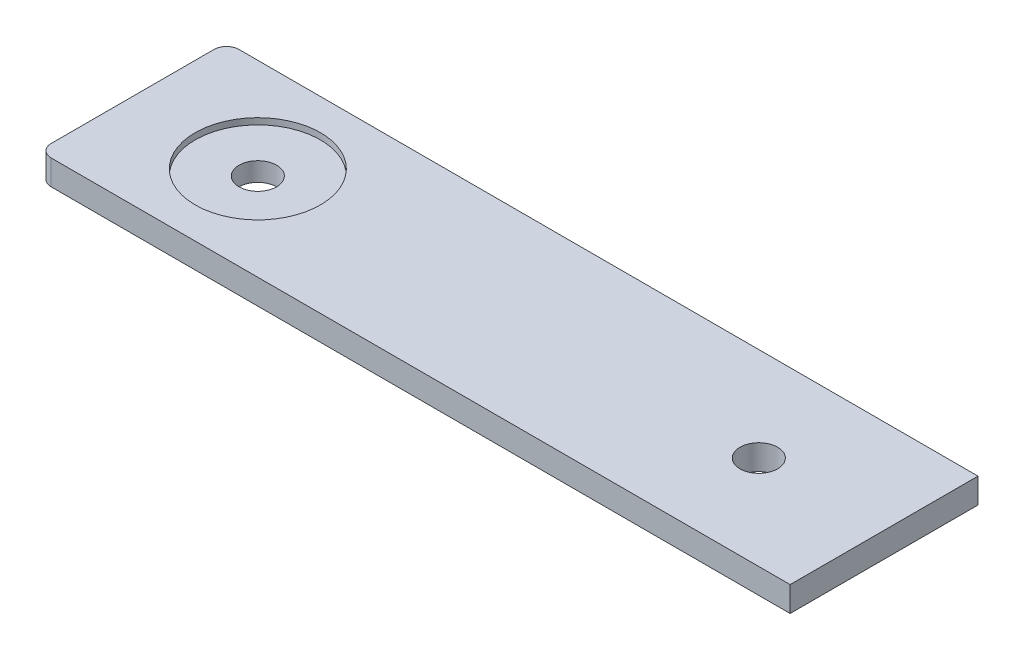
ISO-10303-21;
HEADER;
FILE_DESCRIPTION(('STEP AP214'),'2;1');
FILE_NAME('part.step','',(''),(''),'','','');
FILE_SCHEMA(('AUTOMOTIVE_DESIGN { 1 0 10303 214 1 1 1 1 }'));
ENDSEC;
DATA;
#1=APPLICATION_CONTEXT('core data for automotive mechanical design processes');
#2=APPLICATION_PROTOCOL_DEFINITION('international standard','automotive_design',2000,#1);
#3=PRODUCT_CONTEXT('',#1,'mechanical');
#4=PRODUCT('Part','Part','',(#3));
#5=PRODUCT_RELATED_PRODUCT_CATEGORY('part','',(#4));
#6=PRODUCT_DEFINITION_FORMATION('','',#4);
#7=PRODUCT_DEFINITION_CONTEXT('part definition',#1,'design');
#8=PRODUCT_DEFINITION('design','',#6,#7);
#9=PRODUCT_DEFINITION_SHAPE('','',#8);
#10=(LENGTH_UNIT() NAMED_UNIT(*) SI_UNIT(.MILLI.,.METRE.));
#11=(NAMED_UNIT(*) PLANE_ANGLE_UNIT() SI_UNIT($,.RADIAN.));
#12=(NAMED_UNIT(*) SI_UNIT($,.STERADIAN.) SOLID_ANGLE_UNIT());
#13=UNCERTAINTY_MEASURE_WITH_UNIT(LENGTH_MEASURE(1.E-05),#10,'distance_accuracy_value','');
#14=(GEOMETRIC_REPRESENTATION_CONTEXT(3) GLOBAL_UNCERTAINTY_ASSIGNED_CONTEXT((#13)) GLOBAL_UNIT_ASSIGNED_CONTEXT((#10,
#11,#12)) REPRESENTATION_CONTEXT('',''));
#15=CARTESIAN_POINT('',(0.,0.,0.));
#16=DIRECTION('',(0.,0.,1.));
#17=DIRECTION('',(1.,0.,0.));
#18=AXIS2_PLACEMENT_3D('',#15,#16,#17);
#19=CARTESIAN_POINT('',(10.,2.,-7.5));
#20=DIRECTION('',(0.,-1.,0.));
#21=DIRECTION('',(0.,0.,-1.));
#22=AXIS2_PLACEMENT_3D('',#19,#20,#21);
#23=CYLINDRICAL_SURFACE('',#22,1.5);
#24=CARTESIAN_POINT('',(10.,0.,-7.5));
#25=DIRECTION('',(0.,1.,0.));
#26=DIRECTION('',(0.,0.,1.));
#27=AXIS2_PLACEMENT_3D('',#24,#25,#26);
#28=CIRCLE('',#27,1.5);
#29=CARTESIAN_POINT('',(10.,0.,-6.));
#30=VERTEX_POINT('',#29);
#31=EDGE_CURVE('E146',#30,#30,#28,.T.);
#32=ORIENTED_EDGE('',*,*,#31,.F.);
#33=EDGE_LOOP('',(#32));
#34=FACE_BOUND('',#33,.T.);
#35=CARTESIAN_POINT('',(10.,1.5,-7.5));
#36=DIRECTION('',(0.,1.,0.));
#37=DIRECTION('',(0.,0.,1.));
#38=AXIS2_PLACEMENT_3D('',#35,#36,#37);
#39=CIRCLE('',#38,1.5);
#40=CARTESIAN_POINT('',(10.,1.5,-6.));
#41=VERTEX_POINT('',#40);
#42=EDGE_CURVE('E117',#41,#41,#39,.T.);
#43=ORIENTED_EDGE('',*,*,#42,.T.);
#44=EDGE_LOOP('',(#43));
#45=FACE_BOUND('',#44,.T.);
#46=ADVANCED_FACE('F35',(#34,#45),#23,.F.);
#47=CARTESIAN_POINT('',(0.,2.,-15.));
#48=DIRECTION('',(0.,0.,-1.));
#49=DIRECTION('',(-1.,0.,0.));
#50=AXIS2_PLACEMENT_3D('',#47,#48,#49);
#51=PLANE('',#50);
#52=DIRECTION('',(1.,0.,0.));
#53=VECTOR('',#52,1.);
#54=CARTESIAN_POINT('',(0.,0.,-15.));
#55=LINE('',#54,#53);
#56=CARTESIAN_POINT('',(1.,0.,-15.));
#57=VERTEX_POINT('',#56);
#58=CARTESIAN_POINT('',(60.,0.,-15.));
#59=VERTEX_POINT('',#58);
#60=EDGE_CURVE('E143',#57,#59,#55,.T.);
#61=ORIENTED_EDGE('',*,*,#60,.F.);
#62=DIRECTION('',(0.,-1.,0.));
#63=VECTOR('',#62,1.);
#64=CARTESIAN_POINT('',(1.,2.,-15.));
#65=LINE('',#64,#63);
#66=CARTESIAN_POINT('',(1.,2.,-15.));
#67=VERTEX_POINT('',#66);
#68=EDGE_CURVE('E58',#57,#67,#65,.F.);
#69=ORIENTED_EDGE('',*,*,#68,.T.);
#70=DIRECTION('',(1.,0.,0.));
#71=VECTOR('',#70,1.);
#72=CARTESIAN_POINT('',(0.,2.,-15.));
#73=LINE('',#72,#71);
#74=CARTESIAN_POINT('',(60.,2.,-15.));
#75=VERTEX_POINT('',#74);
#76=EDGE_CURVE('E131',#67,#75,#73,.T.);
#77=ORIENTED_EDGE('',*,*,#76,.T.);
#78=DIRECTION('',(0.,-1.,0.));
#79=VECTOR('',#78,1.);
#80=CARTESIAN_POINT('',(60.,2.,-15.));
#81=LINE('',#80,#79);
#82=EDGE_CURVE('E104',#75,#59,#81,.T.);
#83=ORIENTED_EDGE('',*,*,#82,.T.);
#84=EDGE_LOOP('',(#61,#69,#77,#83));
#85=FACE_BOUND('',#84,.T.);
#86=ADVANCED_FACE('F145',(#85),#51,.T.);
#87=CARTESIAN_POINT('',(0.,2.,0.));
#88=DIRECTION('',(-1.,0.,0.));
#89=DIRECTION('',(0.,0.,1.));
#90=AXIS2_PLACEMENT_3D('',#87,#88,#89);
#91=PLANE('',#90);
#92=DIRECTION('',(0.,0.,-1.));
#93=VECTOR('',#92,1.);
#94=CARTESIAN_POINT('',(0.,2.,0.));
#95=LINE('',#94,#93);
#96=CARTESIAN_POINT('',(0.,2.,-1.));
#97=VERTEX_POINT('',#96);
#98=CARTESIAN_POINT('',(0.,2.,-14.));
#99=VERTEX_POINT('',#98);
#100=EDGE_CURVE('E96',#97,#99,#95,.T.);
#101=ORIENTED_EDGE('',*,*,#100,.T.);
#102=DIRECTION('',(0.,-1.,0.));
#103=VECTOR('',#102,1.);
#104=CARTESIAN_POINT('',(0.,2.,-14.));
#105=LINE('',#104,#103);
#106=CARTESIAN_POINT('',(0.,0.,-14.));
#107=VERTEX_POINT('',#106);
#108=EDGE_CURVE('E112',#99,#107,#105,.T.);
#109=ORIENTED_EDGE('',*,*,#108,.T.);
#110=DIRECTION('',(0.,0.,-1.));
#111=VECTOR('',#110,1.);
#112=CARTESIAN_POINT('',(0.,0.,0.));
#113=LINE('',#112,#111);
#114=CARTESIAN_POINT('',(0.,0.,-1.));
#115=VERTEX_POINT('',#114);
#116=EDGE_CURVE('E144',#115,#107,#113,.T.);
#117=ORIENTED_EDGE('',*,*,#116,.F.);
#118=DIRECTION('',(0.,-1.,0.));
#119=VECTOR('',#118,1.);
#120=CARTESIAN_POINT('',(0.,2.,-1.));
#121=LINE('',#120,#119);
#122=EDGE_CURVE('E110',#115,#97,#121,.F.);
#123=ORIENTED_EDGE('',*,*,#122,.T.);
#124=EDGE_LOOP('',(#101,#109,#117,#123));
#125=FACE_BOUND('',#124,.T.);
#126=ADVANCED_FACE('F135',(#125),#91,.T.);
#127=CARTESIAN_POINT('',(0.,2.,0.));
#128=DIRECTION('',(0.,0.,-1.));
#129=DIRECTION('',(-1.,0.,0.));
#130=AXIS2_PLACEMENT_3D('',#127,#128,#129);
#131=PLANE('',#130);
#132=DIRECTION('',(1.,0.,0.));
#133=VECTOR('',#132,1.);
#134=CARTESIAN_POINT('',(0.,2.,0.));
#135=LINE('',#134,#133);
#136=CARTESIAN_POINT('',(1.,2.,0.));
#137=VERTEX_POINT('',#136);
#138=CARTESIAN_POINT('',(60.,2.,0.));
#139=VERTEX_POINT('',#138);
#140=EDGE_CURVE('E88',#137,#139,#135,.T.);
#141=ORIENTED_EDGE('',*,*,#140,.F.);
#142=DIRECTION('',(0.,-1.,0.));
#143=VECTOR('',#142,1.);
#144=CARTESIAN_POINT('',(1.,0.,0.));
#145=LINE('',#144,#143);
#146=CARTESIAN_POINT('',(1.,0.,0.));
#147=VERTEX_POINT('',#146);
#148=EDGE_CURVE('E11',#137,#147,#145,.T.);
#149=ORIENTED_EDGE('',*,*,#148,.T.);
#150=DIRECTION('',(1.,0.,0.));
#151=VECTOR('',#150,1.);
#152=CARTESIAN_POINT('',(0.,0.,0.));
#153=LINE('',#152,#151);
#154=CARTESIAN_POINT('',(60.,0.,0.));
#155=VERTEX_POINT('',#154);
#156=EDGE_CURVE('E108',#147,#155,#153,.T.);
#157=ORIENTED_EDGE('',*,*,#156,.T.);
#158=DIRECTION('',(0.,-1.,0.));
#159=VECTOR('',#158,1.);
#160=CARTESIAN_POINT('',(60.,2.,0.));
#161=LINE('',#160,#159);
#162=EDGE_CURVE('E102',#139,#155,#161,.T.);
#163=ORIENTED_EDGE('',*,*,#162,.F.);
#164=EDGE_LOOP('',(#141,#149,#157,#163));
#165=FACE_BOUND('',#164,.T.);
#166=ADVANCED_FACE('F106',(#165),#131,.F.);
#167=CARTESIAN_POINT('',(50.,2.,-7.5));
#168=DIRECTION('',(0.,-1.,0.));
#169=DIRECTION('',(0.,0.,-1.));
#170=AXIS2_PLACEMENT_3D('',#167,#168,#169);
#171=CYLINDRICAL_SURFACE('',#170,1.5);
#172=CARTESIAN_POINT('',(50.,2.,-7.5));
#173=DIRECTION('',(0.,1.,0.));
#174=DIRECTION('',(0.,0.,1.));
#175=AXIS2_PLACEMENT_3D('',#172,#173,#174);
#176=CIRCLE('',#175,1.5);
#177=CARTESIAN_POINT('',(50.,2.,-6.));
#178=VERTEX_POINT('',#177);
#179=EDGE_CURVE('E154',#178,#178,#176,.T.);
#180=ORIENTED_EDGE('',*,*,#179,.T.);
#181=EDGE_LOOP('',(#180));
#182=FACE_BOUND('',#181,.T.);
#183=CARTESIAN_POINT('',(50.,0.,-7.5));
#184=DIRECTION('',(0.,1.,0.));
#185=DIRECTION('',(0.,0.,1.));
#186=AXIS2_PLACEMENT_3D('',#183,#184,#185);
#187=CIRCLE('',#186,1.5);
#188=CARTESIAN_POINT('',(50.,0.,-6.));
#189=VERTEX_POINT('',#188);
#190=EDGE_CURVE('E119',#189,#189,#187,.T.);
#191=ORIENTED_EDGE('',*,*,#190,.F.);
#192=EDGE_LOOP('',(#191));
#193=FACE_BOUND('',#192,.T.);
#194=ADVANCED_FACE('F168',(#182,#193),#171,.F.);
#195=CARTESIAN_POINT('',(60.,2.,0.));
#196=DIRECTION('',(-1.,0.,0.));
#197=DIRECTION('',(0.,0.,1.));
#198=AXIS2_PLACEMENT_3D('',#195,#196,#197);
#199=PLANE('',#198);
#200=DIRECTION('',(0.,0.,-1.));
#201=VECTOR('',#200,1.);
#202=CARTESIAN_POINT('',(60.,0.,0.));
#203=LINE('',#202,#201);
#204=EDGE_CURVE('E153',#155,#59,#203,.T.);
#205=ORIENTED_EDGE('',*,*,#204,.T.);
#206=ORIENTED_EDGE('',*,*,#82,.F.);
#207=DIRECTION('',(0.,0.,-1.));
#208=VECTOR('',#207,1.);
#209=CARTESIAN_POINT('',(60.,2.,0.));
#210=LINE('',#209,#208);
#211=EDGE_CURVE('E91',#139,#75,#210,.T.);
#212=ORIENTED_EDGE('',*,*,#211,.F.);
#213=ORIENTED_EDGE('',*,*,#162,.T.);
#214=EDGE_LOOP('',(#205,#206,#212,#213));
#215=FACE_BOUND('',#214,.T.);
#216=ADVANCED_FACE('F101',(#215),#199,.F.);
#217=CARTESIAN_POINT('',(0.,2.,0.));
#218=DIRECTION('',(0.,1.,0.));
#219=DIRECTION('',(0.,0.,1.));
#220=AXIS2_PLACEMENT_3D('',#217,#218,#219);
#221=PLANE('',#220);
#222=CARTESIAN_POINT('',(10.,2.,-7.5));
#223=DIRECTION('',(0.,1.,0.));
#224=DIRECTION('',(0.,0.,1.));
#225=AXIS2_PLACEMENT_3D('',#222,#223,#224);
#226=CIRCLE('',#225,5.);
#227=CARTESIAN_POINT('',(10.,2.,-2.5));
#228=VERTEX_POINT('',#227);
#229=EDGE_CURVE('E161',#228,#228,#226,.T.);
#230=ORIENTED_EDGE('',*,*,#229,.F.);
#231=EDGE_LOOP('',(#230));
#232=FACE_BOUND('',#231,.T.);
#233=ORIENTED_EDGE('',*,*,#179,.F.);
#234=EDGE_LOOP('',(#233));
#235=FACE_BOUND('',#234,.T.);
#236=ORIENTED_EDGE('',*,*,#76,.F.);
#237=CARTESIAN_POINT('',(1.,2.,-14.));
#238=DIRECTION('',(0.,1.,0.));
#239=DIRECTION('',(0.,0.,1.));
#240=AXIS2_PLACEMENT_3D('',#237,#238,#239);
#241=CIRCLE('',#240,1.);
#242=EDGE_CURVE('E43',#67,#99,#241,.T.);
#243=ORIENTED_EDGE('',*,*,#242,.T.);
#244=ORIENTED_EDGE('',*,*,#100,.F.);
#245=CARTESIAN_POINT('',(1.,2.,-1.));
#246=DIRECTION('',(0.,1.,0.));
#247=DIRECTION('',(0.,0.,1.));
#248=AXIS2_PLACEMENT_3D('',#245,#246,#247);
#249=CIRCLE('',#248,1.);
#250=EDGE_CURVE('E50',#97,#137,#249,.T.);
#251=ORIENTED_EDGE('',*,*,#250,.T.);
#252=ORIENTED_EDGE('',*,*,#140,.T.);
#253=ORIENTED_EDGE('',*,*,#211,.T.);
#254=EDGE_LOOP('',(#236,#243,#244,#251,#252,#253));
#255=FACE_BOUND('',#254,.T.);
#256=ADVANCED_FACE('F90',(#232,#235,#255),#221,.T.);
#257=CARTESIAN_POINT('',(0.,0.,0.));
#258=DIRECTION('',(0.,1.,0.));
#259=DIRECTION('',(0.,0.,1.));
#260=AXIS2_PLACEMENT_3D('',#257,#258,#259);
#261=PLANE('',#260);
#262=ORIENTED_EDGE('',*,*,#190,.T.);
#263=EDGE_LOOP('',(#262));
#264=FACE_BOUND('',#263,.T.);
#265=ORIENTED_EDGE('',*,*,#31,.T.);
#266=EDGE_LOOP('',(#265));
#267=FACE_BOUND('',#266,.T.);
#268=ORIENTED_EDGE('',*,*,#116,.T.);
#269=CARTESIAN_POINT('',(1.,0.,-14.));
#270=DIRECTION('',(0.,1.,0.));
#271=DIRECTION('',(0.,0.,1.));
#272=AXIS2_PLACEMENT_3D('',#269,#270,#271);
#273=CIRCLE('',#272,1.);
#274=EDGE_CURVE('E126',#107,#57,#273,.F.);
#275=ORIENTED_EDGE('',*,*,#274,.T.);
#276=ORIENTED_EDGE('',*,*,#60,.T.);
#277=ORIENTED_EDGE('',*,*,#204,.F.);
#278=ORIENTED_EDGE('',*,*,#156,.F.);
#279=CARTESIAN_POINT('',(1.,0.,-1.));
#280=DIRECTION('',(0.,1.,0.));
#281=DIRECTION('',(0.,0.,1.));
#282=AXIS2_PLACEMENT_3D('',#279,#280,#281);
#283=CIRCLE('',#282,1.);
#284=EDGE_CURVE('E124',#147,#115,#283,.F.);
#285=ORIENTED_EDGE('',*,*,#284,.T.);
#286=EDGE_LOOP('',(#268,#275,#276,#277,#278,#285));
#287=FACE_BOUND('',#286,.T.);
#288=ADVANCED_FACE('F142',(#264,#267,#287),#261,.F.);
#289=CARTESIAN_POINT('',(10.,1.5,-7.5));
#290=DIRECTION('',(0.,1.,0.));
#291=DIRECTION('',(0.,0.,1.));
#292=AXIS2_PLACEMENT_3D('',#289,#290,#291);
#293=CYLINDRICAL_SURFACE('',#292,5.);
#294=CARTESIAN_POINT('',(10.,1.5,-7.5));
#295=DIRECTION('',(0.,1.,0.));
#296=DIRECTION('',(0.,0.,1.));
#297=AXIS2_PLACEMENT_3D('',#294,#295,#296);
#298=CIRCLE('',#297,5.);
#299=CARTESIAN_POINT('',(10.,1.5,-2.5));
#300=VERTEX_POINT('',#299);
#301=EDGE_CURVE('E120',#300,#300,#298,.T.);
#302=ORIENTED_EDGE('',*,*,#301,.F.);
#303=EDGE_LOOP('',(#302));
#304=FACE_BOUND('',#303,.T.);
#305=ORIENTED_EDGE('',*,*,#229,.T.);
#306=EDGE_LOOP('',(#305));
#307=FACE_BOUND('',#306,.T.);
#308=ADVANCED_FACE('F193',(#304,#307),#293,.F.);
#309=CARTESIAN_POINT('',(10.,1.5,-7.5));
#310=DIRECTION('',(0.,1.,0.));
#311=DIRECTION('',(0.,0.,1.));
#312=AXIS2_PLACEMENT_3D('',#309,#310,#311);
#313=PLANE('',#312);
#314=ORIENTED_EDGE('',*,*,#42,.F.);
#315=EDGE_LOOP('',(#314));
#316=FACE_BOUND('',#315,.T.);
#317=ORIENTED_EDGE('',*,*,#301,.T.);
#318=EDGE_LOOP('',(#317));
#319=FACE_BOUND('',#318,.T.);
#320=ADVANCED_FACE('F199',(#316,#319),#313,.T.);
#321=CARTESIAN_POINT('',(1.,2.,-14.));
#322=DIRECTION('',(0.,-1.,0.));
#323=DIRECTION('',(0.,0.,-1.));
#324=AXIS2_PLACEMENT_3D('',#321,#322,#323);
#325=CYLINDRICAL_SURFACE('',#324,1.);
#326=ORIENTED_EDGE('',*,*,#242,.F.);
#327=ORIENTED_EDGE('',*,*,#68,.F.);
#328=ORIENTED_EDGE('',*,*,#274,.F.);
#329=ORIENTED_EDGE('',*,*,#108,.F.);
#330=EDGE_LOOP('',(#326,#327,#328,#329));
#331=FACE_BOUND('',#330,.T.);
#332=ADVANCED_FACE('F140',(#331),#325,.T.);
#333=CARTESIAN_POINT('',(1.,2.,-1.));
#334=DIRECTION('',(0.,1.,0.));
#335=DIRECTION('',(0.,0.,1.));
#336=AXIS2_PLACEMENT_3D('',#333,#334,#335);
#337=CYLINDRICAL_SURFACE('',#336,1.);
#338=ORIENTED_EDGE('',*,*,#250,.F.);
#339=ORIENTED_EDGE('',*,*,#122,.F.);
#340=ORIENTED_EDGE('',*,*,#284,.F.);
#341=ORIENTED_EDGE('',*,*,#148,.F.);
#342=EDGE_LOOP('',(#338,#339,#340,#341));
#343=FACE_BOUND('',#342,.T.);
#344=ADVANCED_FACE('F37',(#343),#337,.T.);
#345=CLOSED_SHELL('',(#46,#86,#126,#166,#194,#216,#256,#288,#308,#320,#332,#344));
#346=MANIFOLD_SOLID_BREP('B2',#345);
#347=ADVANCED_BREP_SHAPE_REPRESENTATION('',(#18,#346),#14);
#348=SHAPE_DEFINITION_REPRESENTATION(#9,#347);
ENDSEC;
END-ISO-10303-21;
